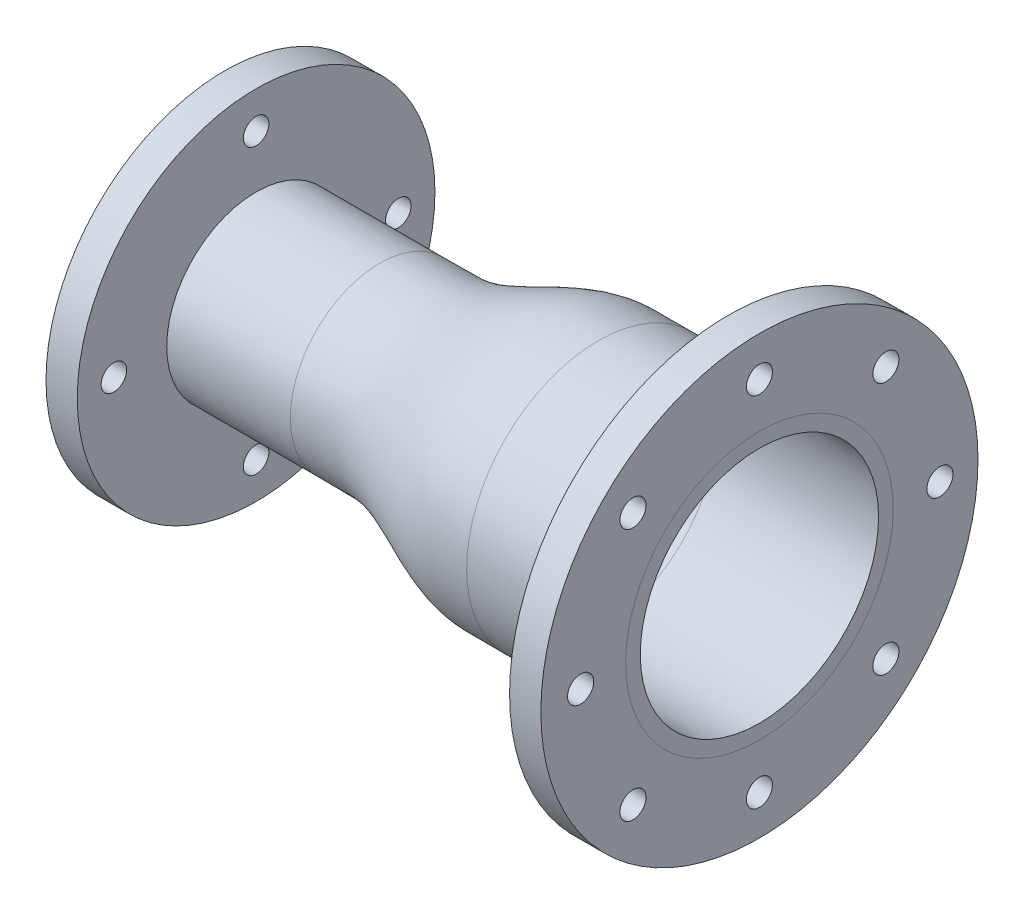
ISO-10303-21;
HEADER;
FILE_DESCRIPTION(('STEP AP214'),'2;1');
FILE_NAME('part.step','',(''),(''),'','','');
FILE_SCHEMA(('AUTOMOTIVE_DESIGN { 1 0 10303 214 1 1 1 1 }'));
ENDSEC;
DATA;
#1=APPLICATION_CONTEXT('core data for automotive mechanical design processes');
#2=APPLICATION_PROTOCOL_DEFINITION('international standard','automotive_design',2000,#1);
#3=PRODUCT_CONTEXT('',#1,'mechanical');
#4=PRODUCT('Part','Part','',(#3));
#5=PRODUCT_RELATED_PRODUCT_CATEGORY('part','',(#4));
#6=PRODUCT_DEFINITION_FORMATION('','',#4);
#7=PRODUCT_DEFINITION_CONTEXT('part definition',#1,'design');
#8=PRODUCT_DEFINITION('design','',#6,#7);
#9=PRODUCT_DEFINITION_SHAPE('','',#8);
#10=(LENGTH_UNIT() NAMED_UNIT(*) SI_UNIT(.MILLI.,.METRE.));
#11=(NAMED_UNIT(*) PLANE_ANGLE_UNIT() SI_UNIT($,.RADIAN.));
#12=(NAMED_UNIT(*) SI_UNIT($,.STERADIAN.) SOLID_ANGLE_UNIT());
#13=UNCERTAINTY_MEASURE_WITH_UNIT(LENGTH_MEASURE(1.E-05),#10,'distance_accuracy_value','');
#14=(GEOMETRIC_REPRESENTATION_CONTEXT(3) GLOBAL_UNCERTAINTY_ASSIGNED_CONTEXT((#13)) GLOBAL_UNIT_ASSIGNED_CONTEXT((#10,
#11,#12)) REPRESENTATION_CONTEXT('',''));
#15=CARTESIAN_POINT('',(0.,0.,0.));
#16=DIRECTION('',(0.,0.,1.));
#17=DIRECTION('',(1.,0.,0.));
#18=AXIS2_PLACEMENT_3D('',#15,#16,#17);
#19=CARTESIAN_POINT('',(341.700000000001,76.1374992115442,0.));
#20=DIRECTION('',(1.,0.,0.));
#21=DIRECTION('',(0.,0.,-1.));
#22=AXIS2_PLACEMENT_3D('',#19,#20,#21);
#23=PLANE('',#22);
#24=CARTESIAN_POINT('',(341.700000000001,114.3,0.));
#25=DIRECTION('',(-1.,0.,0.));
#26=DIRECTION('',(0.,0.,1.));
#27=AXIS2_PLACEMENT_3D('',#24,#25,#26);
#28=CIRCLE('',#27,8.33373999999999);
#29=CARTESIAN_POINT('',(341.700000000001,114.3,8.33373999999999));
#30=VERTEX_POINT('',#29);
#31=EDGE_CURVE('E158',#30,#30,#28,.T.);
#32=ORIENTED_EDGE('',*,*,#31,.T.);
#33=EDGE_LOOP('',(#32));
#34=FACE_BOUND('',#33,.T.);
#35=CARTESIAN_POINT('',(341.700000000001,0.,-115.366574490714));
#36=DIRECTION('',(-1.,0.,0.));
#37=DIRECTION('',(0.,0.,1.));
#38=AXIS2_PLACEMENT_3D('',#35,#36,#37);
#39=CIRCLE('',#38,8.33373999999999);
#40=CARTESIAN_POINT('',(341.700000000001,0.,-107.032834490714));
#41=VERTEX_POINT('',#40);
#42=EDGE_CURVE('E165',#41,#41,#39,.T.);
#43=ORIENTED_EDGE('',*,*,#42,.T.);
#44=EDGE_LOOP('',(#43));
#45=FACE_BOUND('',#44,.T.);
#46=CARTESIAN_POINT('',(341.700000000001,80.822305089622,-80.8223050896228));
#47=DIRECTION('',(-1.,0.,0.));
#48=DIRECTION('',(0.,0.,1.));
#49=AXIS2_PLACEMENT_3D('',#46,#47,#48);
#50=CIRCLE('',#49,8.33373999999999);
#51=CARTESIAN_POINT('',(341.700000000001,80.822305089622,-72.4885650896228));
#52=VERTEX_POINT('',#51);
#53=EDGE_CURVE('E166',#52,#52,#50,.T.);
#54=ORIENTED_EDGE('',*,*,#53,.T.);
#55=EDGE_LOOP('',(#54));
#56=FACE_BOUND('',#55,.T.);
#57=CARTESIAN_POINT('',(341.700000000001,80.8223050896225,80.8223050896222));
#58=DIRECTION('',(-1.,0.,0.));
#59=DIRECTION('',(0.,0.,1.));
#60=AXIS2_PLACEMENT_3D('',#57,#58,#59);
#61=CIRCLE('',#60,8.33373999999999);
#62=CARTESIAN_POINT('',(341.700000000001,80.8223050896225,89.1560450896222));
#63=VERTEX_POINT('',#62);
#64=EDGE_CURVE('E175',#63,#63,#61,.T.);
#65=ORIENTED_EDGE('',*,*,#64,.T.);
#66=EDGE_LOOP('',(#65));
#67=FACE_BOUND('',#66,.T.);
#68=CARTESIAN_POINT('',(341.700000000001,0.,114.3));
#69=DIRECTION('',(-1.,0.,0.));
#70=DIRECTION('',(0.,0.,1.));
#71=AXIS2_PLACEMENT_3D('',#68,#69,#70);
#72=CIRCLE('',#71,8.33373999999999);
#73=CARTESIAN_POINT('',(341.700000000001,0.,122.63374));
#74=VERTEX_POINT('',#73);
#75=EDGE_CURVE('E176',#74,#74,#72,.T.);
#76=ORIENTED_EDGE('',*,*,#75,.T.);
#77=EDGE_LOOP('',(#76));
#78=FACE_BOUND('',#77,.T.);
#79=CARTESIAN_POINT('',(341.700000000001,-80.8223050896222,80.8223050896226));
#80=DIRECTION('',(-1.,0.,0.));
#81=DIRECTION('',(0.,0.,1.));
#82=AXIS2_PLACEMENT_3D('',#79,#80,#81);
#83=CIRCLE('',#82,8.33373999999999);
#84=CARTESIAN_POINT('',(341.700000000001,-80.8223050896222,89.1560450896226));
#85=VERTEX_POINT('',#84);
#86=EDGE_CURVE('E179',#85,#85,#83,.T.);
#87=ORIENTED_EDGE('',*,*,#86,.T.);
#88=EDGE_LOOP('',(#87));
#89=FACE_BOUND('',#88,.T.);
#90=CARTESIAN_POINT('',(341.700000000001,-114.351753494402,0.));
#91=DIRECTION('',(-1.,0.,0.));
#92=DIRECTION('',(0.,0.,1.));
#93=AXIS2_PLACEMENT_3D('',#90,#91,#92);
#94=CIRCLE('',#93,8.33373999999999);
#95=CARTESIAN_POINT('',(341.700000000001,-114.351753494402,8.33373999999999));
#96=VERTEX_POINT('',#95);
#97=EDGE_CURVE('E183',#96,#96,#94,.T.);
#98=ORIENTED_EDGE('',*,*,#97,.T.);
#99=EDGE_LOOP('',(#98));
#100=FACE_BOUND('',#99,.T.);
#101=CARTESIAN_POINT('',(341.700000000001,-80.8223050896231,-80.8223050896217));
#102=DIRECTION('',(-1.,0.,0.));
#103=DIRECTION('',(0.,0.,1.));
#104=AXIS2_PLACEMENT_3D('',#101,#102,#103);
#105=CIRCLE('',#104,8.33373999999999);
#106=CARTESIAN_POINT('',(341.700000000001,-80.8223050896231,-72.4885650896217));
#107=VERTEX_POINT('',#106);
#108=EDGE_CURVE('E115',#107,#107,#105,.T.);
#109=ORIENTED_EDGE('',*,*,#108,.T.);
#110=EDGE_LOOP('',(#109));
#111=FACE_BOUND('',#110,.T.);
#112=CARTESIAN_POINT('',(341.700000000001,0.,0.));
#113=DIRECTION('',(1.,0.,0.));
#114=DIRECTION('',(0.,0.,-1.));
#115=AXIS2_PLACEMENT_3D('',#112,#113,#114);
#116=CIRCLE('',#115,139.7);
#117=CARTESIAN_POINT('',(341.700000000001,0.,-139.7));
#118=VERTEX_POINT('',#117);
#119=EDGE_CURVE('E69',#118,#118,#116,.T.);
#120=ORIENTED_EDGE('',*,*,#119,.T.);
#121=EDGE_LOOP('',(#120));
#122=FACE_BOUND('',#121,.T.);
#123=CARTESIAN_POINT('',(341.700000000001,0.,0.));
#124=DIRECTION('',(1.,0.,0.));
#125=DIRECTION('',(0.,0.,-1.));
#126=AXIS2_PLACEMENT_3D('',#123,#124,#125);
#127=CIRCLE('',#126,85.5);
#128=CARTESIAN_POINT('',(341.700000000001,0.,-85.5));
#129=VERTEX_POINT('',#128);
#130=EDGE_CURVE('E10',#129,#129,#127,.F.);
#131=ORIENTED_EDGE('',*,*,#130,.T.);
#132=EDGE_LOOP('',(#131));
#133=FACE_BOUND('',#132,.T.);
#134=ADVANCED_FACE('F50',(#34,#45,#56,#67,#78,#89,#100,#111,#122,#133),#23,.T.);
#135=CARTESIAN_POINT('',(98.9999999993154,49.1499994635115,0.));
#136=CARTESIAN_POINT('',(102.005905795316,49.1499994635115,0.));
#137=CARTESIAN_POINT('',(106.514717733581,49.1500058205691,0.));
#138=CARTESIAN_POINT('',(111.775161973298,49.1499909865593,0.));
#139=CARTESIAN_POINT('',(114.780889972295,49.1500134485051,0.));
#140=CARTESIAN_POINT('',(117.035873073658,49.1499522232787,0.));
#141=CARTESIAN_POINT('',(118.913072260754,49.1501175034362,0.));
#142=CARTESIAN_POINT('',(120.417271000994,49.1497546651663,0.));
#143=CARTESIAN_POINT('',(121.356980871118,49.1503997728442,0.));
#144=CARTESIAN_POINT('',(122.100741829042,49.1494261179276,0.));
#145=CARTESIAN_POINT('',(122.930150125829,49.1514009467106,0.));
#146=CARTESIAN_POINT('',(124.437765649482,49.1745599052383,0.));
#147=CARTESIAN_POINT('',(127.403841780676,49.3092880479699,0.));
#148=CARTESIAN_POINT('',(131.615917340567,49.7302277733076,0.));
#149=CARTESIAN_POINT('',(136.556364248026,50.5597942292282,0.));
#150=CARTESIAN_POINT('',(141.378908995782,51.6620611481624,0.));
#151=CARTESIAN_POINT('',(147.641323860487,53.4297377742553,0.));
#152=CARTESIAN_POINT('',(155.164556547672,56.0793335742276,0.));
#153=CARTESIAN_POINT('',(163.790302615286,59.6453273603352,0.));
#154=CARTESIAN_POINT('',(172.126179656528,63.3455105597902,0.));
#155=CARTESIAN_POINT('',(180.275439822738,66.9614310497359,0.));
#156=CARTESIAN_POINT('',(188.321466772932,70.2832946888392,0.));
#157=CARTESIAN_POINT('',(194.985358163584,72.6231096372375,0.));
#158=CARTESIAN_POINT('',(200.298712295905,74.1206931091162,0.));
#159=CARTESIAN_POINT('',(204.27061261078,75.0271646674049,0.));
#160=CARTESIAN_POINT('',(208.229301379162,75.6893673997792,0.));
#161=CARTESIAN_POINT('',(211.496695075637,76.0156520568596,0.));
#162=CARTESIAN_POINT('',(213.792519106971,76.1189386638725,0.));
#163=CARTESIAN_POINT('',(215.066881493287,76.1388526472972,0.));
#164=CARTESIAN_POINT('',(216.128457097101,76.1382361001372,0.));
#165=CARTESIAN_POINT('',(217.290602157146,76.1367778298357,0.));
#166=CARTESIAN_POINT('',(218.784669959143,76.1380232475798,0.));
#167=CARTESIAN_POINT('',(220.664664611946,76.1372831486288,0.));
#168=CARTESIAN_POINT('',(222.918904327775,76.1375683266448,0.));
#169=CARTESIAN_POINT('',(225.924981159851,76.1374582812377,0.));
#170=CARTESIAN_POINT('',(231.185175341817,76.1375299775448,0.));
#171=CARTESIAN_POINT('',(235.6940942797,76.1374992113344,0.));
#172=CARTESIAN_POINT('',(238.700000001038,76.1374992115442,0.));
#173=B_SPLINE_CURVE_WITH_KNOTS('',3,(#135,#136,#137,#138,#139,#140,#141,#142,#143,#144,#145,
#146,#147,#148,#149,#150,#151,#152,#153,#154,#155,#156,#157,#158,#159,#160,#161,#162,#163,#164,
#165,#166,#167,#168,#169,#170,#171,#172),.UNSPECIFIED.,.F.,.F.,(4,1,1,1,1,1,1,1,1,1,1,1,1,1,1,1,
1,1,1,1,1,1,1,1,1,1,1,1,1,1,1,1,1,1,1,4),(0.,0.0625,0.09375,0.109375,0.125,0.140625,0.1484375,
0.15625,0.16015625,0.1640625,0.171875,0.1875,0.21875,0.25,0.28125,0.3125,0.375,0.4375,0.5,
0.5625,0.625,0.6875,0.71875,0.75,0.78125,0.8125,0.828125,0.8359375,0.84375,0.8515625,0.859375,
0.875,0.890625,0.90625,0.9375,1.),.UNSPECIFIED.);
#174=CARTESIAN_POINT('',(341.700000000001,0.,0.));
#175=DIRECTION('',(1.,0.,0.));
#176=AXIS1_PLACEMENT('',#174,#175);
#177=SURFACE_OF_REVOLUTION('',#173,#176);
#178=CARTESIAN_POINT('',(238.700000001038,0.,0.));
#179=DIRECTION('',(1.,0.,0.));
#180=DIRECTION('',(0.,0.,-1.));
#181=AXIS2_PLACEMENT_3D('',#178,#179,#180);
#182=CIRCLE('',#181,76.1374992115442);
#183=CARTESIAN_POINT('',(238.700000001038,0.,-76.1374992115442));
#184=VERTEX_POINT('',#183);
#185=EDGE_CURVE('E57',#184,#184,#182,.T.);
#186=ORIENTED_EDGE('',*,*,#185,.T.);
#187=EDGE_LOOP('',(#186));
#188=FACE_BOUND('',#187,.T.);
#189=CARTESIAN_POINT('',(98.9999999993154,0.,0.));
#190=DIRECTION('',(1.,0.,0.));
#191=DIRECTION('',(0.,0.,-1.));
#192=AXIS2_PLACEMENT_3D('',#189,#190,#191);
#193=CIRCLE('',#192,49.1499994635115);
#194=CARTESIAN_POINT('',(98.9999999993154,0.,-49.1499994635115));
#195=VERTEX_POINT('',#194);
#196=EDGE_CURVE('E108',#195,#195,#193,.T.);
#197=ORIENTED_EDGE('',*,*,#196,.F.);
#198=EDGE_LOOP('',(#197));
#199=FACE_BOUND('',#198,.T.);
#200=ADVANCED_FACE('F47',(#188,#199),#177,.F.);
#201=CARTESIAN_POINT('',(341.700000000001,0.,0.));
#202=DIRECTION('',(1.,0.,0.));
#203=DIRECTION('',(0.,0.,-1.));
#204=AXIS2_PLACEMENT_3D('',#201,#202,#203);
#205=CYLINDRICAL_SURFACE('',#204,76.1374992115442);
#206=CARTESIAN_POINT('',(341.700000000001,0.,0.));
#207=DIRECTION('',(1.,0.,0.));
#208=DIRECTION('',(0.,0.,-1.));
#209=AXIS2_PLACEMENT_3D('',#206,#207,#208);
#210=CIRCLE('',#209,76.1374992115442);
#211=CARTESIAN_POINT('',(341.700000000001,0.,-76.1374992115442));
#212=VERTEX_POINT('',#211);
#213=EDGE_CURVE('E61',#212,#212,#210,.T.);
#214=ORIENTED_EDGE('',*,*,#213,.T.);
#215=EDGE_LOOP('',(#214));
#216=FACE_BOUND('',#215,.T.);
#217=ORIENTED_EDGE('',*,*,#185,.F.);
#218=EDGE_LOOP('',(#217));
#219=FACE_BOUND('',#218,.T.);
#220=ADVANCED_FACE('F143',(#216,#219),#205,.F.);
#221=ORIENTED_EDGE('',*,*,#130,.F.);
#222=EDGE_LOOP('',(#221));
#223=FACE_BOUND('',#222,.T.);
#224=ORIENTED_EDGE('',*,*,#213,.F.);
#225=EDGE_LOOP('',(#224));
#226=FACE_BOUND('',#225,.T.);
#227=ADVANCED_FACE('F145',(#223,#226),#23,.T.);
#228=CARTESIAN_POINT('',(341.700000000001,0.,0.));
#229=DIRECTION('',(1.,0.,0.));
#230=DIRECTION('',(0.,0.,-1.));
#231=AXIS2_PLACEMENT_3D('',#228,#229,#230);
#232=CYLINDRICAL_SURFACE('',#231,139.7);
#233=CARTESIAN_POINT('',(321.700000000001,0.,0.));
#234=DIRECTION('',(1.,0.,0.));
#235=DIRECTION('',(0.,0.,-1.));
#236=AXIS2_PLACEMENT_3D('',#233,#234,#235);
#237=CIRCLE('',#236,139.7);
#238=CARTESIAN_POINT('',(321.700000000001,0.,-139.7));
#239=VERTEX_POINT('',#238);
#240=EDGE_CURVE('E77',#239,#239,#237,.T.);
#241=ORIENTED_EDGE('',*,*,#240,.T.);
#242=EDGE_LOOP('',(#241));
#243=FACE_BOUND('',#242,.T.);
#244=ORIENTED_EDGE('',*,*,#119,.F.);
#245=EDGE_LOOP('',(#244));
#246=FACE_BOUND('',#245,.T.);
#247=ADVANCED_FACE('F140',(#243,#246),#232,.T.);
#248=CARTESIAN_POINT('',(321.700000000001,139.7,0.));
#249=DIRECTION('',(-1.,0.,0.));
#250=DIRECTION('',(0.,0.,1.));
#251=AXIS2_PLACEMENT_3D('',#248,#249,#250);
#252=PLANE('',#251);
#253=CARTESIAN_POINT('',(321.700000000001,114.3,0.));
#254=DIRECTION('',(-1.,0.,0.));
#255=DIRECTION('',(0.,0.,1.));
#256=AXIS2_PLACEMENT_3D('',#253,#254,#255);
#257=CIRCLE('',#256,16.1544);
#258=CARTESIAN_POINT('',(321.700000000001,114.3,16.1544));
#259=VERTEX_POINT('',#258);
#260=EDGE_CURVE('E270',#259,#259,#257,.T.);
#261=ORIENTED_EDGE('',*,*,#260,.F.);
#262=EDGE_LOOP('',(#261));
#263=FACE_BOUND('',#262,.T.);
#264=CARTESIAN_POINT('',(321.700000000001,0.,-115.366574490714));
#265=DIRECTION('',(-1.,0.,0.));
#266=DIRECTION('',(0.,0.,1.));
#267=AXIS2_PLACEMENT_3D('',#264,#265,#266);
#268=CIRCLE('',#267,16.1544);
#269=CARTESIAN_POINT('',(321.700000000001,0.,-99.2121744907141));
#270=VERTEX_POINT('',#269);
#271=EDGE_CURVE('E260',#270,#270,#268,.T.);
#272=ORIENTED_EDGE('',*,*,#271,.F.);
#273=EDGE_LOOP('',(#272));
#274=FACE_BOUND('',#273,.T.);
#275=CARTESIAN_POINT('',(321.700000000001,80.822305089622,-80.8223050896228));
#276=DIRECTION('',(-1.,0.,0.));
#277=DIRECTION('',(0.,0.,1.));
#278=AXIS2_PLACEMENT_3D('',#275,#276,#277);
#279=CIRCLE('',#278,16.1544);
#280=CARTESIAN_POINT('',(321.700000000001,80.822305089622,-64.6679050896228));
#281=VERTEX_POINT('',#280);
#282=EDGE_CURVE('E247',#281,#281,#279,.T.);
#283=ORIENTED_EDGE('',*,*,#282,.F.);
#284=EDGE_LOOP('',(#283));
#285=FACE_BOUND('',#284,.T.);
#286=CARTESIAN_POINT('',(321.700000000001,80.8223050896225,80.8223050896222));
#287=DIRECTION('',(-1.,0.,0.));
#288=DIRECTION('',(0.,0.,1.));
#289=AXIS2_PLACEMENT_3D('',#286,#287,#288);
#290=CIRCLE('',#289,16.1544);
#291=CARTESIAN_POINT('',(321.700000000001,80.8223050896225,96.9767050896222));
#292=VERTEX_POINT('',#291);
#293=EDGE_CURVE('E238',#292,#292,#290,.T.);
#294=ORIENTED_EDGE('',*,*,#293,.F.);
#295=EDGE_LOOP('',(#294));
#296=FACE_BOUND('',#295,.T.);
#297=CARTESIAN_POINT('',(321.700000000001,0.,114.3));
#298=DIRECTION('',(-1.,0.,0.));
#299=DIRECTION('',(0.,0.,1.));
#300=AXIS2_PLACEMENT_3D('',#297,#298,#299);
#301=CIRCLE('',#300,16.1544);
#302=CARTESIAN_POINT('',(321.700000000001,0.,130.4544));
#303=VERTEX_POINT('',#302);
#304=EDGE_CURVE('E226',#303,#303,#301,.T.);
#305=ORIENTED_EDGE('',*,*,#304,.F.);
#306=EDGE_LOOP('',(#305));
#307=FACE_BOUND('',#306,.T.);
#308=CARTESIAN_POINT('',(321.700000000001,-80.8223050896222,80.8223050896226));
#309=DIRECTION('',(-1.,0.,0.));
#310=DIRECTION('',(0.,0.,1.));
#311=AXIS2_PLACEMENT_3D('',#308,#309,#310);
#312=CIRCLE('',#311,16.1544);
#313=CARTESIAN_POINT('',(321.700000000001,-80.8223050896222,96.9767050896226));
#314=VERTEX_POINT('',#313);
#315=EDGE_CURVE('E217',#314,#314,#312,.T.);
#316=ORIENTED_EDGE('',*,*,#315,.F.);
#317=EDGE_LOOP('',(#316));
#318=FACE_BOUND('',#317,.T.);
#319=CARTESIAN_POINT('',(321.700000000001,-114.351753494402,0.));
#320=DIRECTION('',(-1.,0.,0.));
#321=DIRECTION('',(0.,0.,1.));
#322=AXIS2_PLACEMENT_3D('',#319,#320,#321);
#323=CIRCLE('',#322,16.1544);
#324=CARTESIAN_POINT('',(321.700000000001,-114.351753494402,16.1544));
#325=VERTEX_POINT('',#324);
#326=EDGE_CURVE('E206',#325,#325,#323,.T.);
#327=ORIENTED_EDGE('',*,*,#326,.F.);
#328=EDGE_LOOP('',(#327));
#329=FACE_BOUND('',#328,.T.);
#330=CARTESIAN_POINT('',(321.700000000001,-80.8223050896231,-80.8223050896217));
#331=DIRECTION('',(-1.,0.,0.));
#332=DIRECTION('',(0.,0.,1.));
#333=AXIS2_PLACEMENT_3D('',#330,#331,#332);
#334=CIRCLE('',#333,16.1544);
#335=CARTESIAN_POINT('',(321.700000000001,-80.8223050896231,-64.6679050896217));
#336=VERTEX_POINT('',#335);
#337=EDGE_CURVE('E196',#336,#336,#334,.T.);
#338=ORIENTED_EDGE('',*,*,#337,.F.);
#339=EDGE_LOOP('',(#338));
#340=FACE_BOUND('',#339,.T.);
#341=CARTESIAN_POINT('',(321.700000000001,0.,0.));
#342=DIRECTION('',(1.,0.,0.));
#343=DIRECTION('',(0.,0.,-1.));
#344=AXIS2_PLACEMENT_3D('',#341,#342,#343);
#345=CIRCLE('',#344,84.1374992115442);
#346=CARTESIAN_POINT('',(321.700000000001,0.,-84.1374992115442));
#347=VERTEX_POINT('',#346);
#348=EDGE_CURVE('E78',#347,#347,#345,.T.);
#349=ORIENTED_EDGE('',*,*,#348,.T.);
#350=EDGE_LOOP('',(#349));
#351=FACE_BOUND('',#350,.T.);
#352=ORIENTED_EDGE('',*,*,#240,.F.);
#353=EDGE_LOOP('',(#352));
#354=FACE_BOUND('',#353,.T.);
#355=ADVANCED_FACE('F133',(#263,#274,#285,#296,#307,#318,#329,#340,#351,#354),#252,.T.);
#356=CARTESIAN_POINT('',(341.700000000001,0.,0.));
#357=DIRECTION('',(1.,0.,0.));
#358=DIRECTION('',(0.,0.,-1.));
#359=AXIS2_PLACEMENT_3D('',#356,#357,#358);
#360=CYLINDRICAL_SURFACE('',#359,84.1374992115442);
#361=CARTESIAN_POINT('',(238.70000000048,0.,0.));
#362=DIRECTION('',(1.,0.,0.));
#363=DIRECTION('',(0.,0.,-1.));
#364=AXIS2_PLACEMENT_3D('',#361,#362,#363);
#365=CIRCLE('',#364,84.1374992115442);
#366=CARTESIAN_POINT('',(238.70000000048,0.,-84.1374992115442));
#367=VERTEX_POINT('',#366);
#368=EDGE_CURVE('E81',#367,#367,#365,.T.);
#369=ORIENTED_EDGE('',*,*,#368,.T.);
#370=EDGE_LOOP('',(#369));
#371=FACE_BOUND('',#370,.T.);
#372=ORIENTED_EDGE('',*,*,#348,.F.);
#373=EDGE_LOOP('',(#372));
#374=FACE_BOUND('',#373,.T.);
#375=ADVANCED_FACE('F126',(#371,#374),#360,.T.);
#376=CARTESIAN_POINT('',(238.70000000048,84.1374992115442,0.));
#377=CARTESIAN_POINT('',(238.355924074551,84.1374992115202,0.));
#378=CARTESIAN_POINT('',(237.667772222694,84.137499211472,0.));
#379=CARTESIAN_POINT('',(236.43892963008,84.1374992118427,0.));
#380=CARTESIAN_POINT('',(234.866011111601,84.1374992093122,0.));
#381=CARTESIAN_POINT('',(233.096477777994,84.1374992210845,0.));
#382=CARTESIAN_POINT('',(231.179483334397,84.1374991812726,0.));
#383=CARTESIAN_POINT('',(229.409949997447,84.1374993464701,0.));
#384=CARTESIAN_POINT('',(227.492955565207,84.1374987853929,0.));
#385=CARTESIAN_POINT('',(225.723422181095,84.13750111552,0.));
#386=CARTESIAN_POINT('',(223.806427909022,84.1374932020653,0.));
#387=CARTESIAN_POINT('',(222.036893859715,84.1375260673476,0.));
#388=CARTESIAN_POINT('',(220.119901846725,84.1374144528191,0.));
#389=CARTESIAN_POINT('',(218.350358415225,84.1378779989106,0.));
#390=CARTESIAN_POINT('',(216.436180481603,84.1363060251998,0.));
#391=CARTESIAN_POINT('',(214.671251810697,84.1428084951467,0.));
#392=CARTESIAN_POINT('',(212.761120780671,84.0867493050435,0.));
#393=CARTESIAN_POINT('',(210.9979704213,83.9818944784432,0.));
#394=CARTESIAN_POINT('',(209.088061418414,83.8116109676752,0.));
#395=CARTESIAN_POINT('',(207.325068084927,83.603702947119,0.));
#396=CARTESIAN_POINT('',(205.415339804882,83.3255776907741,0.));
#397=CARTESIAN_POINT('',(203.652528826209,83.0214768563703,0.));
#398=CARTESIAN_POINT('',(201.742980231223,82.6430546511927,0.));
#399=CARTESIAN_POINT('',(199.980349522116,82.2500814543988,0.));
#400=CARTESIAN_POINT('',(198.070973132176,81.7795890573477,0.));
#401=CARTESIAN_POINT('',(196.308510240827,81.3056366662936,0.));
#402=CARTESIAN_POINT('',(194.399291637108,80.7519213173461,0.));
#403=CARTESIAN_POINT('',(192.636978054457,80.2054342772218,0.));
#404=CARTESIAN_POINT('',(190.727898374793,79.5779232881772,0.));
#405=CARTESIAN_POINT('',(188.965712472328,78.9678586538311,0.));
#406=CARTESIAN_POINT('',(187.056750606921,78.2765114224032,0.));
#407=CARTESIAN_POINT('',(185.294669761322,77.6122903503984,0.));
#408=CARTESIAN_POINT('',(183.385803914716,76.8675406775993,0.));
#409=CARTESIAN_POINT('',(181.623805853851,76.158991089653,0.));
#410=CARTESIAN_POINT('',(179.715014471059,75.3716801136279,0.));
#411=CARTESIAN_POINT('',(177.95307795001,74.6289709788003,0.));
#412=CARTESIAN_POINT('',(176.044340155356,73.8102714548487,0.));
#413=CARTESIAN_POINT('',(174.282445120439,73.0438396560823,0.));
#414=CARTESIAN_POINT('',(172.373740783917,72.2051729542145,0.));
#415=CARTESIAN_POINT('',(170.611868191777,71.4256440883498,0.));
#416=CARTESIAN_POINT('',(168.70177228903,70.5779678092316,0.));
#417=CARTESIAN_POINT('',(166.937395899018,69.7949596588317,0.));
#418=CARTESIAN_POINT('',(165.024786726744,68.9494536465284,0.));
#419=CARTESIAN_POINT('',(163.259291454049,68.17439041256,0.));
#420=CARTESIAN_POINT('',(161.346657228072,67.3438616642089,0.));
#421=CARTESIAN_POINT('',(159.581128610411,66.5879813262985,0.));
#422=CARTESIAN_POINT('',(157.668449277296,65.7840030271469,0.));
#423=CARTESIAN_POINT('',(155.902867536155,65.0578995061593,0.));
#424=CARTESIAN_POINT('',(153.990122342702,64.2918325065566,0.));
#425=CARTESIAN_POINT('',(152.224466539885,63.6058636402684,0.));
#426=CARTESIAN_POINT('',(150.311633973931,62.8887699211763,0.));
#427=CARTESIAN_POINT('',(148.545882007944,62.2529807386855,0.));
#428=CARTESIAN_POINT('',(146.632940071268,61.5955435311837,0.));
#429=CARTESIAN_POINT('',(144.867069113347,61.019596499319,0.));
#430=CARTESIAN_POINT('',(142.953996030364,60.4320486383424,0.));
#431=CARTESIAN_POINT('',(141.187983586384,59.9251619950834,0.));
#432=CARTESIAN_POINT('',(139.274759097703,59.4172235456774,0.));
#433=CARTESIAN_POINT('',(137.508584812843,58.9881184916577,0.));
#434=CARTESIAN_POINT('',(135.595192140913,58.5689442371156,0.));
#435=CARTESIAN_POINT('',(133.828840435065,58.2258008751595,0.));
#436=CARTESIAN_POINT('',(131.915268777067,57.9039386315148,0.));
#437=CARTESIAN_POINT('',(130.148732425359,57.6543573124532,0.));
#438=CARTESIAN_POINT('',(128.234978669205,57.437727634692,0.));
#439=CARTESIAN_POINT('',(126.468267149077,57.2886499220858,0.));
#440=CARTESIAN_POINT('',(124.789582716265,57.1974774560598,0.));
#441=CARTESIAN_POINT('',(123.443760708449,57.1569587361165,0.));
#442=CARTESIAN_POINT('',(122.420535806049,57.1490274176523,0.));
#443=CARTESIAN_POINT('',(121.677966993461,57.1501487521835,0.));
#444=CARTESIAN_POINT('',(120.601758891239,57.1498317942184,0.));
#445=CARTESIAN_POINT('',(119.202172332257,57.1500498808639,0.));
#446=CARTESIAN_POINT('',(117.285177742255,57.149983488862,0.));
#447=CARTESIAN_POINT('',(115.515644451759,57.1500030382082,0.));
#448=CARTESIAN_POINT('',(113.598649996977,57.1499983310186,0.));
#449=CARTESIAN_POINT('',(111.829116666664,57.1499997170491,0.));
#450=CARTESIAN_POINT('',(109.912122221469,57.1499993832964,0.));
#451=CARTESIAN_POINT('',(108.142588888334,57.1499994815527,0.));
#452=CARTESIAN_POINT('',(106.225594443819,57.1499994578749,0.));
#453=CARTESIAN_POINT('',(104.456061110483,57.1499994648313,0.));
#454=CARTESIAN_POINT('',(102.539066666016,57.1499994631282,0.));
#455=CARTESIAN_POINT('',(101.039878703039,57.1499994635708,0.));
#456=CARTESIAN_POINT('',(99.8110361104344,57.1499994635114,0.));
#457=CARTESIAN_POINT('',(99.2703453696884,57.1499994635115,0.));
#458=CARTESIAN_POINT('',(98.9999999993154,57.1499994635115,0.));
#459=(BOUNDED_CURVE() B_SPLINE_CURVE(3,(#376,#377,#378,#379,#380,#381,#382,#383,#384,#385,#386,
#387,#388,#389,#390,#391,#392,#393,#394,#395,#396,#397,#398,#399,#400,#401,#402,#403,#404,#405,
#406,#407,#408,#409,#410,#411,#412,#413,#414,#415,#416,#417,#418,#419,#420,#421,#422,#423,#424,
#425,#426,#427,#428,#429,#430,#431,#432,#433,#434,#435,#436,#437,#438,#439,#440,#441,#442,#443,
#444,#445,#446,#447,#448,#449,#450,#451,#452,#453,#454,#455,#456,#457,#458),.UNSPECIFIED.,.F.,
.F.) B_SPLINE_CURVE_WITH_KNOTS((4,1,1,1,1,1,1,1,1,1,1,1,1,1,1,1,1,1,1,1,1,1,1,1,1,1,1,1,1,1,1,1,
1,1,1,1,1,1,1,1,1,1,1,1,1,1,1,1,1,1,1,1,1,1,1,1,1,1,1,1,1,1,1,1,1,1,1,1,1,1,1,1,1,1,1,1,1,1,1,1,
4),(0.,0.00715416466130086,0.0143083293226017,0.0255505880760745,0.0398589173986762,
0.051101176152149,0.0654095054747508,0.0766517642282235,0.0909600935508253,0.102202352304298,
0.1165106816269,0.127752940380373,0.142061269702974,0.153303528456447,0.167554007786719,
0.178755429228364,0.193030914898765,0.204271904910274,0.218620641734998,0.229935227483346,
0.244395419546109,0.255809504611402,0.270408809056224,0.281939941450494,0.29669540911253,
0.308352906833696,0.323271342218976,0.335056717549753,0.350135378469548,0.362042997576286,
0.3772705556946,0.389288475006168,0.40464616843142,0.416757098654122,0.432220020972812,
0.444402380472081,0.45994086361034,0.472169892049146,0.487750951123586,0.499999861803356,
0.515620649586765,0.527886880088368,0.543480106626163,0.555711059560346,0.571242544952542,
0.583412273814947,0.598850533365244,0.610935794468536,0.626253517756318,0.638234914593141,
0.653410393103734,0.665273470015964,0.680291944874892,0.692028203974552,0.706883095638552,
0.718490902382347,0.733184871620732,0.744670204017162,0.759215980069462,0.770592965802685,
0.785013865191362,0.796305043597434,0.810635097760218,0.821871343483024,0.831256631837378,
0.838627864782687,0.843146284568772,0.846696471543553,0.861004800866154,0.872247059619627,
0.886555388942229,0.897797647695702,0.912105977018304,0.923348235771776,0.937656565094378,
0.948898823847851,0.963207153170453,0.974449411923925,0.988757741246527,0.994378870623264,1.),
.UNSPECIFIED.) CURVE() GEOMETRIC_REPRESENTATION_ITEM() RATIONAL_B_SPLINE_CURVE((0.576132147620015,
0.576132147620015,0.576132147620016,0.576132147620015,0.576132147620016,0.576132147620015,
0.576132147620015,0.576132147620015,0.576132147620015,0.576132147620016,0.576132147620015,
0.576132147620016,0.576132147620015,0.576132147620015,0.576132147620015,0.576132147620015,
0.576132147620016,0.576132147620015,0.576132147620016,0.576132147620016,0.576132147620015,
0.576132147620016,0.576132147620015,0.576132147620016,0.576132147620015,0.576132147620015,
0.576132147620015,0.576132147620015,0.576132147620015,0.576132147620015,0.576132147620016,
0.576132147620015,0.576132147620016,0.576132147620015,0.576132147620016,0.576132147620016,
0.576132147620015,0.576132147620015,0.576132147620015,0.576132147620016,0.576132147620015,
0.576132147620015,0.576132147620016,0.576132147620015,0.576132147620016,0.576132147620015,
0.576132147620015,0.576132147620015,0.576132147620016,0.576132147620015,0.576132147620015,
0.576132147620015,0.576132147620015,0.576132147620016,0.576132147620015,0.576132147620015,
0.576132147620015,0.576132147620015,0.576132147620015,0.576132147620016,0.576132147620015,
0.576132147620016,0.576132147620015,0.576132147620015,0.576132147620015,0.576132147620015,
0.576132147620015,0.576132147620015,0.576132147620015,0.576132147620016,0.576132147620015,
0.576132147620016,0.576132147620015,0.576132147620016,0.576132147620016,0.576132147620016,
0.576132147620015,0.576132147620016,0.576132147620015,0.576132147620016,0.576132147620015,
0.576132147620015,0.576132147620015)) REPRESENTATION_ITEM(''));
#460=CARTESIAN_POINT('',(341.700000000001,0.,0.));
#461=DIRECTION('',(1.,0.,0.));
#462=AXIS1_PLACEMENT('',#460,#461);
#463=SURFACE_OF_REVOLUTION('',#459,#462);
#464=CARTESIAN_POINT('',(98.9999999993154,0.,0.));
#465=DIRECTION('',(1.,0.,0.));
#466=DIRECTION('',(0.,0.,-1.));
#467=AXIS2_PLACEMENT_3D('',#464,#465,#466);
#468=CIRCLE('',#467,57.1499994635115);
#469=CARTESIAN_POINT('',(98.9999999993154,0.,-57.1499994635115));
#470=VERTEX_POINT('',#469);
#471=EDGE_CURVE('E87',#470,#470,#468,.T.);
#472=ORIENTED_EDGE('',*,*,#471,.T.);
#473=EDGE_LOOP('',(#472));
#474=FACE_BOUND('',#473,.T.);
#475=ORIENTED_EDGE('',*,*,#368,.F.);
#476=EDGE_LOOP('',(#475));
#477=FACE_BOUND('',#476,.T.);
#478=ADVANCED_FACE('F121',(#474,#477),#463,.F.);
#479=CARTESIAN_POINT('',(341.700000000001,0.,0.));
#480=DIRECTION('',(1.,0.,0.));
#481=DIRECTION('',(0.,0.,-1.));
#482=AXIS2_PLACEMENT_3D('',#479,#480,#481);
#483=CYLINDRICAL_SURFACE('',#482,57.1499994635115);
#484=CARTESIAN_POINT('',(20.,0.,0.));
#485=DIRECTION('',(1.,0.,0.));
#486=DIRECTION('',(0.,0.,-1.));
#487=AXIS2_PLACEMENT_3D('',#484,#485,#486);
#488=CIRCLE('',#487,57.1499994635115);
#489=CARTESIAN_POINT('',(20.,0.,-57.1499994635115));
#490=VERTEX_POINT('',#489);
#491=EDGE_CURVE('E94',#490,#490,#488,.T.);
#492=ORIENTED_EDGE('',*,*,#491,.T.);
#493=EDGE_LOOP('',(#492));
#494=FACE_BOUND('',#493,.T.);
#495=ORIENTED_EDGE('',*,*,#471,.F.);
#496=EDGE_LOOP('',(#495));
#497=FACE_BOUND('',#496,.T.);
#498=ADVANCED_FACE('F130',(#494,#497),#483,.T.);
#499=CARTESIAN_POINT('',(20.,114.3,0.));
#500=DIRECTION('',(1.,0.,0.));
#501=DIRECTION('',(0.,0.,-1.));
#502=AXIS2_PLACEMENT_3D('',#499,#500,#501);
#503=PLANE('',#502);
#504=CARTESIAN_POINT('',(20.,90.8527596999048,0.));
#505=DIRECTION('',(1.,0.,0.));
#506=DIRECTION('',(0.,0.,-1.));
#507=AXIS2_PLACEMENT_3D('',#504,#505,#506);
#508=CIRCLE('',#507,8.13561999999999);
#509=CARTESIAN_POINT('',(20.,90.8527596999048,-8.13561999999999));
#510=VERTEX_POINT('',#509);
#511=EDGE_CURVE('E298',#510,#510,#508,.F.);
#512=ORIENTED_EDGE('',*,*,#511,.T.);
#513=EDGE_LOOP('',(#512));
#514=FACE_BOUND('',#513,.T.);
#515=CARTESIAN_POINT('',(20.,0.,90.9113801471292));
#516=DIRECTION('',(1.,0.,0.));
#517=DIRECTION('',(0.,0.,-1.));
#518=AXIS2_PLACEMENT_3D('',#515,#516,#517);
#519=CIRCLE('',#518,8.13561999999999);
#520=CARTESIAN_POINT('',(20.,0.,82.7757601471292));
#521=VERTEX_POINT('',#520);
#522=EDGE_CURVE('E290',#521,#521,#519,.F.);
#523=ORIENTED_EDGE('',*,*,#522,.T.);
#524=EDGE_LOOP('',(#523));
#525=FACE_BOUND('',#524,.T.);
#526=CARTESIAN_POINT('',(20.,-90.9113801471292,0.));
#527=DIRECTION('',(1.,0.,0.));
#528=DIRECTION('',(0.,0.,-1.));
#529=AXIS2_PLACEMENT_3D('',#526,#527,#528);
#530=CIRCLE('',#529,8.13561999999999);
#531=CARTESIAN_POINT('',(20.,-90.9113801471292,-8.13561999999999));
#532=VERTEX_POINT('',#531);
#533=EDGE_CURVE('E278',#532,#532,#530,.F.);
#534=ORIENTED_EDGE('',*,*,#533,.T.);
#535=EDGE_LOOP('',(#534));
#536=FACE_BOUND('',#535,.T.);
#537=CARTESIAN_POINT('',(20.,0.,-90.9113801471292));
#538=DIRECTION('',(1.,0.,0.));
#539=DIRECTION('',(0.,0.,-1.));
#540=AXIS2_PLACEMENT_3D('',#537,#538,#539);
#541=CIRCLE('',#540,8.13561999999999);
#542=CARTESIAN_POINT('',(20.,0.,-99.0470001471292));
#543=VERTEX_POINT('',#542);
#544=EDGE_CURVE('E275',#543,#543,#541,.F.);
#545=ORIENTED_EDGE('',*,*,#544,.T.);
#546=EDGE_LOOP('',(#545));
#547=FACE_BOUND('',#546,.T.);
#548=CARTESIAN_POINT('',(20.,0.,0.));
#549=DIRECTION('',(1.,0.,0.));
#550=DIRECTION('',(0.,0.,-1.));
#551=AXIS2_PLACEMENT_3D('',#548,#549,#550);
#552=CIRCLE('',#551,114.3);
#553=CARTESIAN_POINT('',(20.,0.,-114.3));
#554=VERTEX_POINT('',#553);
#555=EDGE_CURVE('E98',#554,#554,#552,.T.);
#556=ORIENTED_EDGE('',*,*,#555,.T.);
#557=EDGE_LOOP('',(#556));
#558=FACE_BOUND('',#557,.T.);
#559=ORIENTED_EDGE('',*,*,#491,.F.);
#560=EDGE_LOOP('',(#559));
#561=FACE_BOUND('',#560,.T.);
#562=ADVANCED_FACE('F323',(#514,#525,#536,#547,#558,#561),#503,.T.);
#563=CARTESIAN_POINT('',(341.700000000001,0.,0.));
#564=DIRECTION('',(1.,0.,0.));
#565=DIRECTION('',(0.,0.,-1.));
#566=AXIS2_PLACEMENT_3D('',#563,#564,#565);
#567=CYLINDRICAL_SURFACE('',#566,114.3);
#568=CARTESIAN_POINT('',(0.,0.,0.));
#569=DIRECTION('',(1.,0.,0.));
#570=DIRECTION('',(0.,0.,-1.));
#571=AXIS2_PLACEMENT_3D('',#568,#569,#570);
#572=CIRCLE('',#571,114.3);
#573=CARTESIAN_POINT('',(0.,0.,-114.3));
#574=VERTEX_POINT('',#573);
#575=EDGE_CURVE('E99',#574,#574,#572,.T.);
#576=ORIENTED_EDGE('',*,*,#575,.T.);
#577=EDGE_LOOP('',(#576));
#578=FACE_BOUND('',#577,.T.);
#579=ORIENTED_EDGE('',*,*,#555,.F.);
#580=EDGE_LOOP('',(#579));
#581=FACE_BOUND('',#580,.T.);
#582=ADVANCED_FACE('F311',(#578,#581),#567,.T.);
#583=CARTESIAN_POINT('',(0.,114.3,0.));
#584=DIRECTION('',(-1.,0.,0.));
#585=DIRECTION('',(0.,0.,1.));
#586=AXIS2_PLACEMENT_3D('',#583,#584,#585);
#587=PLANE('',#586);
#588=CARTESIAN_POINT('',(0.,90.8527596999048,0.));
#589=DIRECTION('',(-1.,0.,0.));
#590=DIRECTION('',(0.,0.,1.));
#591=AXIS2_PLACEMENT_3D('',#588,#589,#590);
#592=CIRCLE('',#591,8.13561999999998);
#593=CARTESIAN_POINT('',(0.,90.8527596999048,8.13561999999998));
#594=VERTEX_POINT('',#593);
#595=EDGE_CURVE('E297',#594,#594,#592,.T.);
#596=ORIENTED_EDGE('',*,*,#595,.F.);
#597=EDGE_LOOP('',(#596));
#598=FACE_BOUND('',#597,.T.);
#599=CARTESIAN_POINT('',(0.,0.,90.9113801471292));
#600=DIRECTION('',(-1.,0.,0.));
#601=DIRECTION('',(0.,0.,1.));
#602=AXIS2_PLACEMENT_3D('',#599,#600,#601);
#603=CIRCLE('',#602,8.13561999999999);
#604=CARTESIAN_POINT('',(0.,0.,99.0470001471292));
#605=VERTEX_POINT('',#604);
#606=EDGE_CURVE('E292',#605,#605,#603,.T.);
#607=ORIENTED_EDGE('',*,*,#606,.F.);
#608=EDGE_LOOP('',(#607));
#609=FACE_BOUND('',#608,.T.);
#610=CARTESIAN_POINT('',(0.,-90.9113801471292,0.));
#611=DIRECTION('',(-1.,0.,0.));
#612=DIRECTION('',(0.,0.,1.));
#613=AXIS2_PLACEMENT_3D('',#610,#611,#612);
#614=CIRCLE('',#613,8.13561999999998);
#615=CARTESIAN_POINT('',(0.,-90.9113801471292,8.13561999999998));
#616=VERTEX_POINT('',#615);
#617=EDGE_CURVE('E283',#616,#616,#614,.T.);
#618=ORIENTED_EDGE('',*,*,#617,.F.);
#619=EDGE_LOOP('',(#618));
#620=FACE_BOUND('',#619,.T.);
#621=CARTESIAN_POINT('',(0.,0.,-90.9113801471292));
#622=DIRECTION('',(-1.,0.,0.));
#623=DIRECTION('',(0.,0.,1.));
#624=AXIS2_PLACEMENT_3D('',#621,#622,#623);
#625=CIRCLE('',#624,8.13561999999999);
#626=CARTESIAN_POINT('',(0.,0.,-82.7757601471292));
#627=VERTEX_POINT('',#626);
#628=EDGE_CURVE('E277',#627,#627,#625,.T.);
#629=ORIENTED_EDGE('',*,*,#628,.F.);
#630=EDGE_LOOP('',(#629));
#631=FACE_BOUND('',#630,.T.);
#632=CARTESIAN_POINT('',(0.,0.,0.));
#633=DIRECTION('',(1.,0.,0.));
#634=DIRECTION('',(0.,0.,-1.));
#635=AXIS2_PLACEMENT_3D('',#632,#633,#634);
#636=CIRCLE('',#635,49.1499994635115);
#637=CARTESIAN_POINT('',(0.,0.,-49.1499994635115));
#638=VERTEX_POINT('',#637);
#639=EDGE_CURVE('E104',#638,#638,#636,.T.);
#640=ORIENTED_EDGE('',*,*,#639,.T.);
#641=EDGE_LOOP('',(#640));
#642=FACE_BOUND('',#641,.T.);
#643=ORIENTED_EDGE('',*,*,#575,.F.);
#644=EDGE_LOOP('',(#643));
#645=FACE_BOUND('',#644,.T.);
#646=ADVANCED_FACE('F310',(#598,#609,#620,#631,#642,#645),#587,.T.);
#647=CARTESIAN_POINT('',(341.700000000001,0.,0.));
#648=DIRECTION('',(1.,0.,0.));
#649=DIRECTION('',(0.,0.,-1.));
#650=AXIS2_PLACEMENT_3D('',#647,#648,#649);
#651=CYLINDRICAL_SURFACE('',#650,49.1499994635115);
#652=ORIENTED_EDGE('',*,*,#196,.T.);
#653=EDGE_LOOP('',(#652));
#654=FACE_BOUND('',#653,.T.);
#655=ORIENTED_EDGE('',*,*,#639,.F.);
#656=EDGE_LOOP('',(#655));
#657=FACE_BOUND('',#656,.T.);
#658=ADVANCED_FACE('F309',(#654,#657),#651,.F.);
#659=CARTESIAN_POINT('',(321.700000000001,-80.8223050896231,-80.8223050896217));
#660=DIRECTION('',(-1.,0.,0.));
#661=DIRECTION('',(0.,0.,1.));
#662=AXIS2_PLACEMENT_3D('',#659,#660,#661);
#663=CYLINDRICAL_SURFACE('',#662,8.33373999999999);
#664=ORIENTED_EDGE('',*,*,#108,.F.);
#665=EDGE_LOOP('',(#664));
#666=FACE_BOUND('',#665,.T.);
#667=CARTESIAN_POINT('',(328.262312921564,-80.8223050896231,-80.8223050896217));
#668=DIRECTION('',(-1.,0.,0.));
#669=DIRECTION('',(0.,0.,1.));
#670=AXIS2_PLACEMENT_3D('',#667,#668,#669);
#671=CIRCLE('',#670,8.33373999999999);
#672=CARTESIAN_POINT('',(328.262312921564,-80.8223050896231,-72.4885650896217));
#673=VERTEX_POINT('',#672);
#674=EDGE_CURVE('E194',#673,#673,#671,.T.);
#675=ORIENTED_EDGE('',*,*,#674,.T.);
#676=EDGE_LOOP('',(#675));
#677=FACE_BOUND('',#676,.T.);
#678=ADVANCED_FACE('F365',(#666,#677),#663,.F.);
#679=CARTESIAN_POINT('',(321.700000000001,-80.8223050896231,-80.8223050896217));
#680=DIRECTION('',(-1.,0.,0.));
#681=DIRECTION('',(0.,0.,1.));
#682=AXIS2_PLACEMENT_3D('',#679,#680,#681);
#683=CONICAL_SURFACE('',#682,16.1544,0.872664625997166);
#684=ORIENTED_EDGE('',*,*,#674,.F.);
#685=EDGE_LOOP('',(#684));
#686=FACE_BOUND('',#685,.T.);
#687=ORIENTED_EDGE('',*,*,#337,.T.);
#688=EDGE_LOOP('',(#687));
#689=FACE_BOUND('',#688,.T.);
#690=ADVANCED_FACE('F381',(#686,#689),#683,.F.);
#691=CARTESIAN_POINT('',(321.700000000001,-114.351753494402,0.));
#692=DIRECTION('',(-1.,0.,0.));
#693=DIRECTION('',(0.,0.,1.));
#694=AXIS2_PLACEMENT_3D('',#691,#692,#693);
#695=CYLINDRICAL_SURFACE('',#694,8.33373999999999);
#696=ORIENTED_EDGE('',*,*,#97,.F.);
#697=EDGE_LOOP('',(#696));
#698=FACE_BOUND('',#697,.T.);
#699=CARTESIAN_POINT('',(328.262312921564,-114.351753494402,0.));
#700=DIRECTION('',(-1.,0.,0.));
#701=DIRECTION('',(0.,0.,1.));
#702=AXIS2_PLACEMENT_3D('',#699,#700,#701);
#703=CIRCLE('',#702,8.33373999999999);
#704=CARTESIAN_POINT('',(328.262312921564,-114.351753494402,8.33373999999999));
#705=VERTEX_POINT('',#704);
#706=EDGE_CURVE('E201',#705,#705,#703,.T.);
#707=ORIENTED_EDGE('',*,*,#706,.T.);
#708=EDGE_LOOP('',(#707));
#709=FACE_BOUND('',#708,.T.);
#710=ADVANCED_FACE('F393',(#698,#709),#695,.F.);
#711=CARTESIAN_POINT('',(321.700000000001,-114.351753494402,0.));
#712=DIRECTION('',(-1.,0.,0.));
#713=DIRECTION('',(0.,0.,1.));
#714=AXIS2_PLACEMENT_3D('',#711,#712,#713);
#715=CONICAL_SURFACE('',#714,16.1544,0.872664625997166);
#716=ORIENTED_EDGE('',*,*,#706,.F.);
#717=EDGE_LOOP('',(#716));
#718=FACE_BOUND('',#717,.T.);
#719=ORIENTED_EDGE('',*,*,#326,.T.);
#720=EDGE_LOOP('',(#719));
#721=FACE_BOUND('',#720,.T.);
#722=ADVANCED_FACE('F404',(#718,#721),#715,.F.);
#723=CARTESIAN_POINT('',(321.700000000001,-80.8223050896222,80.8223050896226));
#724=DIRECTION('',(-1.,0.,0.));
#725=DIRECTION('',(0.,0.,1.));
#726=AXIS2_PLACEMENT_3D('',#723,#724,#725);
#727=CYLINDRICAL_SURFACE('',#726,8.33373999999999);
#728=ORIENTED_EDGE('',*,*,#86,.F.);
#729=EDGE_LOOP('',(#728));
#730=FACE_BOUND('',#729,.T.);
#731=CARTESIAN_POINT('',(328.262312921564,-80.8223050896222,80.8223050896226));
#732=DIRECTION('',(-1.,0.,0.));
#733=DIRECTION('',(0.,0.,1.));
#734=AXIS2_PLACEMENT_3D('',#731,#732,#733);
#735=CIRCLE('',#734,8.33373999999999);
#736=CARTESIAN_POINT('',(328.262312921564,-80.8223050896222,89.1560450896226));
#737=VERTEX_POINT('',#736);
#738=EDGE_CURVE('E211',#737,#737,#735,.T.);
#739=ORIENTED_EDGE('',*,*,#738,.T.);
#740=EDGE_LOOP('',(#739));
#741=FACE_BOUND('',#740,.T.);
#742=ADVANCED_FACE('F413',(#730,#741),#727,.F.);
#743=CARTESIAN_POINT('',(321.700000000001,-80.8223050896222,80.8223050896226));
#744=DIRECTION('',(-1.,0.,0.));
#745=DIRECTION('',(0.,0.,1.));
#746=AXIS2_PLACEMENT_3D('',#743,#744,#745);
#747=CONICAL_SURFACE('',#746,16.1544,0.872664625997166);
#748=ORIENTED_EDGE('',*,*,#738,.F.);
#749=EDGE_LOOP('',(#748));
#750=FACE_BOUND('',#749,.T.);
#751=ORIENTED_EDGE('',*,*,#315,.T.);
#752=EDGE_LOOP('',(#751));
#753=FACE_BOUND('',#752,.T.);
#754=ADVANCED_FACE('F425',(#750,#753),#747,.F.);
#755=CARTESIAN_POINT('',(321.700000000001,0.,114.3));
#756=DIRECTION('',(-1.,0.,0.));
#757=DIRECTION('',(0.,0.,1.));
#758=AXIS2_PLACEMENT_3D('',#755,#756,#757);
#759=CYLINDRICAL_SURFACE('',#758,8.33374);
#760=ORIENTED_EDGE('',*,*,#75,.F.);
#761=EDGE_LOOP('',(#760));
#762=FACE_BOUND('',#761,.T.);
#763=CARTESIAN_POINT('',(328.262312921564,0.,114.3));
#764=DIRECTION('',(-1.,0.,0.));
#765=DIRECTION('',(0.,0.,1.));
#766=AXIS2_PLACEMENT_3D('',#763,#764,#765);
#767=CIRCLE('',#766,8.33374);
#768=CARTESIAN_POINT('',(328.262312921564,0.,122.63374));
#769=VERTEX_POINT('',#768);
#770=EDGE_CURVE('E221',#769,#769,#767,.T.);
#771=ORIENTED_EDGE('',*,*,#770,.T.);
#772=EDGE_LOOP('',(#771));
#773=FACE_BOUND('',#772,.T.);
#774=ADVANCED_FACE('F432',(#762,#773),#759,.F.);
#775=CARTESIAN_POINT('',(321.700000000001,0.,114.3));
#776=DIRECTION('',(-1.,0.,0.));
#777=DIRECTION('',(0.,0.,1.));
#778=AXIS2_PLACEMENT_3D('',#775,#776,#777);
#779=CONICAL_SURFACE('',#778,16.1544,0.872664625997166);
#780=ORIENTED_EDGE('',*,*,#770,.F.);
#781=EDGE_LOOP('',(#780));
#782=FACE_BOUND('',#781,.T.);
#783=ORIENTED_EDGE('',*,*,#304,.T.);
#784=EDGE_LOOP('',(#783));
#785=FACE_BOUND('',#784,.T.);
#786=ADVANCED_FACE('F443',(#782,#785),#779,.F.);
#787=CARTESIAN_POINT('',(321.700000000001,80.8223050896225,80.8223050896222));
#788=DIRECTION('',(-1.,0.,0.));
#789=DIRECTION('',(0.,0.,1.));
#790=AXIS2_PLACEMENT_3D('',#787,#788,#789);
#791=CYLINDRICAL_SURFACE('',#790,8.33373999999999);
#792=ORIENTED_EDGE('',*,*,#64,.F.);
#793=EDGE_LOOP('',(#792));
#794=FACE_BOUND('',#793,.T.);
#795=CARTESIAN_POINT('',(328.262312921564,80.8223050896225,80.8223050896222));
#796=DIRECTION('',(-1.,0.,0.));
#797=DIRECTION('',(0.,0.,1.));
#798=AXIS2_PLACEMENT_3D('',#795,#796,#797);
#799=CIRCLE('',#798,8.33373999999999);
#800=CARTESIAN_POINT('',(328.262312921564,80.8223050896225,89.1560450896222));
#801=VERTEX_POINT('',#800);
#802=EDGE_CURVE('E234',#801,#801,#799,.T.);
#803=ORIENTED_EDGE('',*,*,#802,.T.);
#804=EDGE_LOOP('',(#803));
#805=FACE_BOUND('',#804,.T.);
#806=ADVANCED_FACE('F451',(#794,#805),#791,.F.);
#807=CARTESIAN_POINT('',(321.700000000001,80.8223050896225,80.8223050896222));
#808=DIRECTION('',(-1.,0.,0.));
#809=DIRECTION('',(0.,0.,1.));
#810=AXIS2_PLACEMENT_3D('',#807,#808,#809);
#811=CONICAL_SURFACE('',#810,16.1544,0.872664625997166);
#812=ORIENTED_EDGE('',*,*,#802,.F.);
#813=EDGE_LOOP('',(#812));
#814=FACE_BOUND('',#813,.T.);
#815=ORIENTED_EDGE('',*,*,#293,.T.);
#816=EDGE_LOOP('',(#815));
#817=FACE_BOUND('',#816,.T.);
#818=ADVANCED_FACE('F461',(#814,#817),#811,.F.);
#819=CARTESIAN_POINT('',(321.700000000001,80.822305089622,-80.8223050896228));
#820=DIRECTION('',(-1.,0.,0.));
#821=DIRECTION('',(0.,0.,1.));
#822=AXIS2_PLACEMENT_3D('',#819,#820,#821);
#823=CYLINDRICAL_SURFACE('',#822,8.33373999999999);
#824=ORIENTED_EDGE('',*,*,#53,.F.);
#825=EDGE_LOOP('',(#824));
#826=FACE_BOUND('',#825,.T.);
#827=CARTESIAN_POINT('',(328.262312921564,80.822305089622,-80.8223050896228));
#828=DIRECTION('',(-1.,0.,0.));
#829=DIRECTION('',(0.,0.,1.));
#830=AXIS2_PLACEMENT_3D('',#827,#828,#829);
#831=CIRCLE('',#830,8.33373999999999);
#832=CARTESIAN_POINT('',(328.262312921564,80.822305089622,-72.4885650896228));
#833=VERTEX_POINT('',#832);
#834=EDGE_CURVE('E242',#833,#833,#831,.T.);
#835=ORIENTED_EDGE('',*,*,#834,.T.);
#836=EDGE_LOOP('',(#835));
#837=FACE_BOUND('',#836,.T.);
#838=ADVANCED_FACE('F471',(#826,#837),#823,.F.);
#839=CARTESIAN_POINT('',(321.700000000001,80.822305089622,-80.8223050896228));
#840=DIRECTION('',(-1.,0.,0.));
#841=DIRECTION('',(0.,0.,1.));
#842=AXIS2_PLACEMENT_3D('',#839,#840,#841);
#843=CONICAL_SURFACE('',#842,16.1544,0.872664625997166);
#844=ORIENTED_EDGE('',*,*,#834,.F.);
#845=EDGE_LOOP('',(#844));
#846=FACE_BOUND('',#845,.T.);
#847=ORIENTED_EDGE('',*,*,#282,.T.);
#848=EDGE_LOOP('',(#847));
#849=FACE_BOUND('',#848,.T.);
#850=ADVANCED_FACE('F481',(#846,#849),#843,.F.);
#851=CARTESIAN_POINT('',(321.700000000001,0.,-115.366574490714));
#852=DIRECTION('',(-1.,0.,0.));
#853=DIRECTION('',(0.,0.,1.));
#854=AXIS2_PLACEMENT_3D('',#851,#852,#853);
#855=CYLINDRICAL_SURFACE('',#854,8.33374);
#856=ORIENTED_EDGE('',*,*,#42,.F.);
#857=EDGE_LOOP('',(#856));
#858=FACE_BOUND('',#857,.T.);
#859=CARTESIAN_POINT('',(328.262312921564,0.,-115.366574490714));
#860=DIRECTION('',(-1.,0.,0.));
#861=DIRECTION('',(0.,0.,1.));
#862=AXIS2_PLACEMENT_3D('',#859,#860,#861);
#863=CIRCLE('',#862,8.33374);
#864=CARTESIAN_POINT('',(328.262312921564,0.,-107.032834490714));
#865=VERTEX_POINT('',#864);
#866=EDGE_CURVE('E251',#865,#865,#863,.T.);
#867=ORIENTED_EDGE('',*,*,#866,.T.);
#868=EDGE_LOOP('',(#867));
#869=FACE_BOUND('',#868,.T.);
#870=ADVANCED_FACE('F494',(#858,#869),#855,.F.);
#871=CARTESIAN_POINT('',(321.700000000001,0.,-115.366574490714));
#872=DIRECTION('',(-1.,0.,0.));
#873=DIRECTION('',(0.,0.,1.));
#874=AXIS2_PLACEMENT_3D('',#871,#872,#873);
#875=CONICAL_SURFACE('',#874,16.1544,0.872664625997166);
#876=ORIENTED_EDGE('',*,*,#866,.F.);
#877=EDGE_LOOP('',(#876));
#878=FACE_BOUND('',#877,.T.);
#879=ORIENTED_EDGE('',*,*,#271,.T.);
#880=EDGE_LOOP('',(#879));
#881=FACE_BOUND('',#880,.T.);
#882=ADVANCED_FACE('F502',(#878,#881),#875,.F.);
#883=CARTESIAN_POINT('',(321.700000000001,114.3,0.));
#884=DIRECTION('',(-1.,0.,0.));
#885=DIRECTION('',(0.,0.,1.));
#886=AXIS2_PLACEMENT_3D('',#883,#884,#885);
#887=CYLINDRICAL_SURFACE('',#886,8.33373999999999);
#888=ORIENTED_EDGE('',*,*,#31,.F.);
#889=EDGE_LOOP('',(#888));
#890=FACE_BOUND('',#889,.T.);
#891=CARTESIAN_POINT('',(328.262312921564,114.3,0.));
#892=DIRECTION('',(-1.,0.,0.));
#893=DIRECTION('',(0.,0.,1.));
#894=AXIS2_PLACEMENT_3D('',#891,#892,#893);
#895=CIRCLE('',#894,8.33373999999999);
#896=CARTESIAN_POINT('',(328.262312921564,114.3,8.33373999999999));
#897=VERTEX_POINT('',#896);
#898=EDGE_CURVE('E263',#897,#897,#895,.T.);
#899=ORIENTED_EDGE('',*,*,#898,.T.);
#900=EDGE_LOOP('',(#899));
#901=FACE_BOUND('',#900,.T.);
#902=ADVANCED_FACE('F511',(#890,#901),#887,.F.);
#903=CARTESIAN_POINT('',(321.700000000001,114.3,0.));
#904=DIRECTION('',(-1.,0.,0.));
#905=DIRECTION('',(0.,0.,1.));
#906=AXIS2_PLACEMENT_3D('',#903,#904,#905);
#907=CONICAL_SURFACE('',#906,16.1544,0.872664625997167);
#908=ORIENTED_EDGE('',*,*,#898,.F.);
#909=EDGE_LOOP('',(#908));
#910=FACE_BOUND('',#909,.T.);
#911=ORIENTED_EDGE('',*,*,#260,.T.);
#912=EDGE_LOOP('',(#911));
#913=FACE_BOUND('',#912,.T.);
#914=ADVANCED_FACE('F523',(#910,#913),#907,.F.);
#915=CARTESIAN_POINT('',(0.,0.,-90.9113801471292));
#916=DIRECTION('',(-1.,0.,0.));
#917=DIRECTION('',(0.,0.,1.));
#918=AXIS2_PLACEMENT_3D('',#915,#916,#917);
#919=CYLINDRICAL_SURFACE('',#918,8.13561999999999);
#920=ORIENTED_EDGE('',*,*,#544,.F.);
#921=EDGE_LOOP('',(#920));
#922=FACE_BOUND('',#921,.T.);
#923=ORIENTED_EDGE('',*,*,#628,.T.);
#924=EDGE_LOOP('',(#923));
#925=FACE_BOUND('',#924,.T.);
#926=ADVANCED_FACE('F534',(#922,#925),#919,.F.);
#927=CARTESIAN_POINT('',(0.,-90.9113801471292,0.));
#928=DIRECTION('',(-1.,0.,0.));
#929=DIRECTION('',(0.,0.,1.));
#930=AXIS2_PLACEMENT_3D('',#927,#928,#929);
#931=CYLINDRICAL_SURFACE('',#930,8.13561999999999);
#932=ORIENTED_EDGE('',*,*,#533,.F.);
#933=EDGE_LOOP('',(#932));
#934=FACE_BOUND('',#933,.T.);
#935=ORIENTED_EDGE('',*,*,#617,.T.);
#936=EDGE_LOOP('',(#935));
#937=FACE_BOUND('',#936,.T.);
#938=ADVANCED_FACE('F543',(#934,#937),#931,.F.);
#939=CARTESIAN_POINT('',(0.,0.,90.9113801471292));
#940=DIRECTION('',(-1.,0.,0.));
#941=DIRECTION('',(0.,0.,1.));
#942=AXIS2_PLACEMENT_3D('',#939,#940,#941);
#943=CYLINDRICAL_SURFACE('',#942,8.13561999999999);
#944=ORIENTED_EDGE('',*,*,#522,.F.);
#945=EDGE_LOOP('',(#944));
#946=FACE_BOUND('',#945,.T.);
#947=ORIENTED_EDGE('',*,*,#606,.T.);
#948=EDGE_LOOP('',(#947));
#949=FACE_BOUND('',#948,.T.);
#950=ADVANCED_FACE('F555',(#946,#949),#943,.F.);
#951=CARTESIAN_POINT('',(0.,90.8527596999048,0.));
#952=DIRECTION('',(-1.,0.,0.));
#953=DIRECTION('',(0.,0.,1.));
#954=AXIS2_PLACEMENT_3D('',#951,#952,#953);
#955=CYLINDRICAL_SURFACE('',#954,8.13561999999999);
#956=ORIENTED_EDGE('',*,*,#511,.F.);
#957=EDGE_LOOP('',(#956));
#958=FACE_BOUND('',#957,.T.);
#959=ORIENTED_EDGE('',*,*,#595,.T.);
#960=EDGE_LOOP('',(#959));
#961=FACE_BOUND('',#960,.T.);
#962=ADVANCED_FACE('F304',(#958,#961),#955,.F.);
#963=CLOSED_SHELL('',(#134,#200,#220,#227,#247,#355,#375,#478,#498,#562,#582,#646,#658,#678,
#690,#710,#722,#742,#754,#774,#786,#806,#818,#838,#850,#870,#882,#902,#914,#926,#938,#950,#962));
#964=MANIFOLD_SOLID_BREP('B2',#963);
#965=ADVANCED_BREP_SHAPE_REPRESENTATION('',(#18,#964),#14);
#966=SHAPE_DEFINITION_REPRESENTATION(#9,#965);
ENDSEC;
END-ISO-10303-21;
